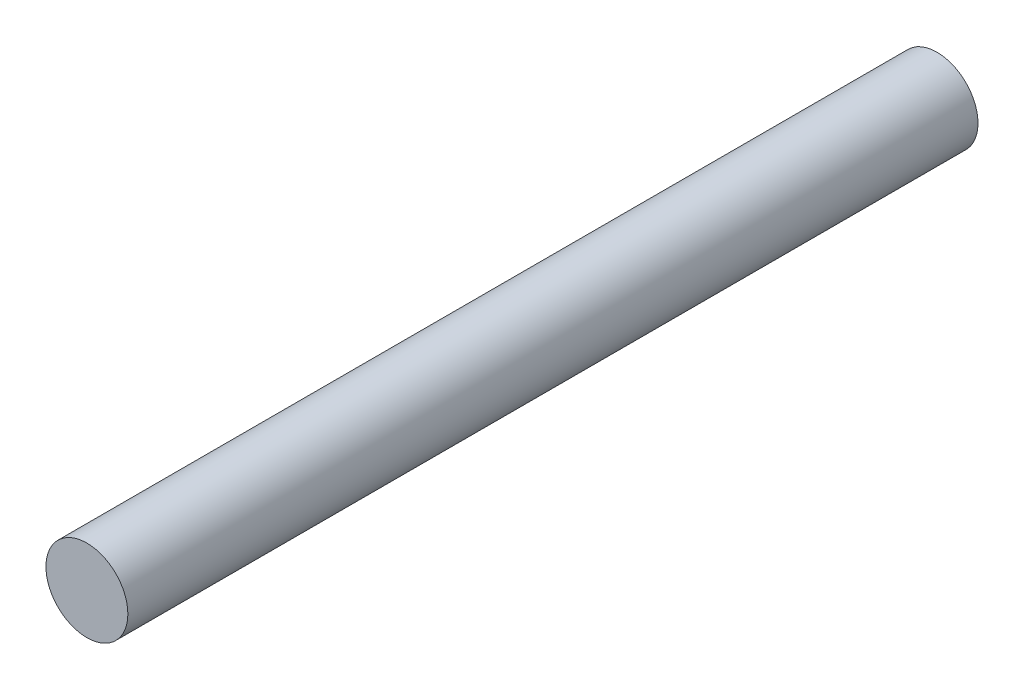
ISO-10303-21;
HEADER;
FILE_DESCRIPTION(('STEP AP214'),'2;1');
FILE_NAME('part.step','',(''),(''),'','','');
FILE_SCHEMA(('AUTOMOTIVE_DESIGN { 1 0 10303 214 1 1 1 1 }'));
ENDSEC;
DATA;
#1=APPLICATION_CONTEXT('core data for automotive mechanical design processes');
#2=APPLICATION_PROTOCOL_DEFINITION('international standard','automotive_design',2000,#1);
#3=PRODUCT_CONTEXT('',#1,'mechanical');
#4=PRODUCT('Part','Part','',(#3));
#5=PRODUCT_RELATED_PRODUCT_CATEGORY('part','',(#4));
#6=PRODUCT_DEFINITION_FORMATION('','',#4);
#7=PRODUCT_DEFINITION_CONTEXT('part definition',#1,'design');
#8=PRODUCT_DEFINITION('design','',#6,#7);
#9=PRODUCT_DEFINITION_SHAPE('','',#8);
#10=(LENGTH_UNIT() NAMED_UNIT(*) SI_UNIT(.MILLI.,.METRE.));
#11=(NAMED_UNIT(*) PLANE_ANGLE_UNIT() SI_UNIT($,.RADIAN.));
#12=(NAMED_UNIT(*) SI_UNIT($,.STERADIAN.) SOLID_ANGLE_UNIT());
#13=UNCERTAINTY_MEASURE_WITH_UNIT(LENGTH_MEASURE(1.E-05),#10,'distance_accuracy_value','');
#14=(GEOMETRIC_REPRESENTATION_CONTEXT(3) GLOBAL_UNCERTAINTY_ASSIGNED_CONTEXT((#13)) GLOBAL_UNIT_ASSIGNED_CONTEXT((#10,
#11,#12)) REPRESENTATION_CONTEXT('',''));
#15=CARTESIAN_POINT('',(0.,0.,0.));
#16=DIRECTION('',(0.,0.,1.));
#17=DIRECTION('',(1.,0.,0.));
#18=AXIS2_PLACEMENT_3D('',#15,#16,#17);
#19=CARTESIAN_POINT('',(0.,0.,41.5));
#20=DIRECTION('',(0.,0.,-1.));
#21=DIRECTION('',(-1.,0.,0.));
#22=AXIS2_PLACEMENT_3D('',#19,#20,#21);
#23=CYLINDRICAL_SURFACE('',#22,2.);
#24=CARTESIAN_POINT('',(0.,0.,41.5));
#25=DIRECTION('',(0.,0.,1.));
#26=DIRECTION('',(1.,0.,0.));
#27=AXIS2_PLACEMENT_3D('',#24,#25,#26);
#28=CIRCLE('',#27,2.);
#29=CARTESIAN_POINT('',(2.,0.,41.5));
#30=VERTEX_POINT('',#29);
#31=EDGE_CURVE('E10',#30,#30,#28,.T.);
#32=ORIENTED_EDGE('',*,*,#31,.F.);
#33=EDGE_LOOP('',(#32));
#34=FACE_BOUND('',#33,.T.);
#35=CARTESIAN_POINT('',(0.,0.,0.));
#36=DIRECTION('',(0.,0.,1.));
#37=DIRECTION('',(1.,0.,0.));
#38=AXIS2_PLACEMENT_3D('',#35,#36,#37);
#39=CIRCLE('',#38,2.);
#40=CARTESIAN_POINT('',(2.,0.,0.));
#41=VERTEX_POINT('',#40);
#42=EDGE_CURVE('E34',#41,#41,#39,.T.);
#43=ORIENTED_EDGE('',*,*,#42,.T.);
#44=EDGE_LOOP('',(#43));
#45=FACE_BOUND('',#44,.T.);
#46=ADVANCED_FACE('F31',(#34,#45),#23,.T.);
#47=CARTESIAN_POINT('',(0.,0.,41.5));
#48=DIRECTION('',(0.,0.,1.));
#49=DIRECTION('',(1.,0.,0.));
#50=AXIS2_PLACEMENT_3D('',#47,#48,#49);
#51=PLANE('',#50);
#52=ORIENTED_EDGE('',*,*,#31,.T.);
#53=EDGE_LOOP('',(#52));
#54=FACE_BOUND('',#53,.T.);
#55=ADVANCED_FACE('F46',(#54),#51,.T.);
#56=CARTESIAN_POINT('',(0.,0.,0.));
#57=DIRECTION('',(0.,0.,1.));
#58=DIRECTION('',(1.,0.,0.));
#59=AXIS2_PLACEMENT_3D('',#56,#57,#58);
#60=PLANE('',#59);
#61=ORIENTED_EDGE('',*,*,#42,.F.);
#62=EDGE_LOOP('',(#61));
#63=FACE_BOUND('',#62,.T.);
#64=ADVANCED_FACE('F44',(#63),#60,.F.);
#65=CLOSED_SHELL('',(#46,#55,#64));
#66=MANIFOLD_SOLID_BREP('B2',#65);
#67=ADVANCED_BREP_SHAPE_REPRESENTATION('',(#18,#66),#14);
#68=SHAPE_DEFINITION_REPRESENTATION(#9,#67);
ENDSEC;
END-ISO-10303-21;
